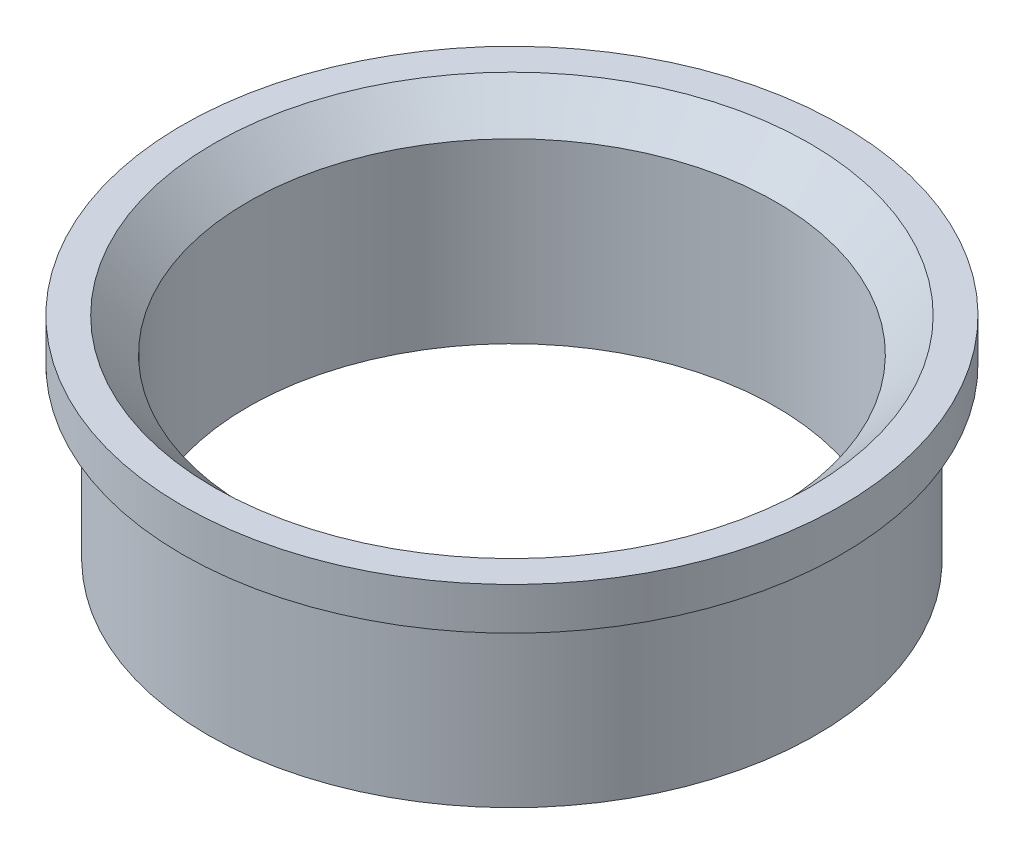
ISO-10303-21;
HEADER;
FILE_DESCRIPTION(('STEP AP214'),'2;1');
FILE_NAME('part.step','',(''),(''),'','','');
FILE_SCHEMA(('AUTOMOTIVE_DESIGN { 1 0 10303 214 1 1 1 1 }'));
ENDSEC;
DATA;
#1=APPLICATION_CONTEXT('core data for automotive mechanical design processes');
#2=APPLICATION_PROTOCOL_DEFINITION('international standard','automotive_design',2000,#1);
#3=PRODUCT_CONTEXT('',#1,'mechanical');
#4=PRODUCT('Part','Part','',(#3));
#5=PRODUCT_RELATED_PRODUCT_CATEGORY('part','',(#4));
#6=PRODUCT_DEFINITION_FORMATION('','',#4);
#7=PRODUCT_DEFINITION_CONTEXT('part definition',#1,'design');
#8=PRODUCT_DEFINITION('design','',#6,#7);
#9=PRODUCT_DEFINITION_SHAPE('','',#8);
#10=(LENGTH_UNIT() NAMED_UNIT(*) SI_UNIT(.MILLI.,.METRE.));
#11=(NAMED_UNIT(*) PLANE_ANGLE_UNIT() SI_UNIT($,.RADIAN.));
#12=(NAMED_UNIT(*) SI_UNIT($,.STERADIAN.) SOLID_ANGLE_UNIT());
#13=UNCERTAINTY_MEASURE_WITH_UNIT(LENGTH_MEASURE(1.E-05),#10,'distance_accuracy_value','');
#14=(GEOMETRIC_REPRESENTATION_CONTEXT(3) GLOBAL_UNCERTAINTY_ASSIGNED_CONTEXT((#13)) GLOBAL_UNIT_ASSIGNED_CONTEXT((#10,
#11,#12)) REPRESENTATION_CONTEXT('',''));
#15=CARTESIAN_POINT('',(0.,0.,0.));
#16=DIRECTION('',(0.,0.,1.));
#17=DIRECTION('',(1.,0.,0.));
#18=AXIS2_PLACEMENT_3D('',#15,#16,#17);
#19=CARTESIAN_POINT('',(72.,0.,0.));
#20=DIRECTION('',(0.,1.,0.));
#21=DIRECTION('',(0.,0.,1.));
#22=AXIS2_PLACEMENT_3D('',#19,#20,#21);
#23=PLANE('',#22);
#24=CARTESIAN_POINT('',(0.,0.,0.));
#25=DIRECTION('',(0.,1.,0.));
#26=DIRECTION('',(0.,0.,1.));
#27=AXIS2_PLACEMENT_3D('',#24,#25,#26);
#28=CIRCLE('',#27,72.);
#29=CARTESIAN_POINT('',(0.,0.,72.));
#30=VERTEX_POINT('',#29);
#31=EDGE_CURVE('E55',#30,#30,#28,.T.);
#32=ORIENTED_EDGE('',*,*,#31,.F.);
#33=EDGE_LOOP('',(#32));
#34=FACE_BOUND('',#33,.T.);
#35=CARTESIAN_POINT('',(0.,0.,0.));
#36=DIRECTION('',(0.,1.,0.));
#37=DIRECTION('',(0.,0.,1.));
#38=AXIS2_PLACEMENT_3D('',#35,#36,#37);
#39=CIRCLE('',#38,62.5);
#40=CARTESIAN_POINT('',(0.,0.,62.5));
#41=VERTEX_POINT('',#40);
#42=EDGE_CURVE('E10',#41,#41,#39,.T.);
#43=ORIENTED_EDGE('',*,*,#42,.T.);
#44=EDGE_LOOP('',(#43));
#45=FACE_BOUND('',#44,.T.);
#46=ADVANCED_FACE('F30',(#34,#45),#23,.F.);
#47=CARTESIAN_POINT('',(0.,72.788119525236,0.));
#48=DIRECTION('',(0.,1.,0.));
#49=DIRECTION('',(0.,0.,1.));
#50=AXIS2_PLACEMENT_3D('',#47,#48,#49);
#51=CYLINDRICAL_SURFACE('',#50,62.5);
#52=ORIENTED_EDGE('',*,*,#42,.F.);
#53=EDGE_LOOP('',(#52));
#54=FACE_BOUND('',#53,.T.);
#55=CARTESIAN_POINT('',(0.,42.,0.));
#56=DIRECTION('',(0.,1.,0.));
#57=DIRECTION('',(0.,0.,1.));
#58=AXIS2_PLACEMENT_3D('',#55,#56,#57);
#59=CIRCLE('',#58,62.5);
#60=CARTESIAN_POINT('',(0.,42.,62.5));
#61=VERTEX_POINT('',#60);
#62=EDGE_CURVE('E36',#61,#61,#59,.T.);
#63=ORIENTED_EDGE('',*,*,#62,.T.);
#64=EDGE_LOOP('',(#63));
#65=FACE_BOUND('',#64,.T.);
#66=ADVANCED_FACE('F62',(#54,#65),#51,.F.);
#67=CARTESIAN_POINT('',(0.,50.,0.));
#68=DIRECTION('',(0.,1.,0.));
#69=DIRECTION('',(0.,0.,1.));
#70=AXIS2_PLACEMENT_3D('',#67,#68,#69);
#71=CONICAL_SURFACE('',#70,70.5,0.785398163397449);
#72=ORIENTED_EDGE('',*,*,#62,.F.);
#73=EDGE_LOOP('',(#72));
#74=FACE_BOUND('',#73,.T.);
#75=CARTESIAN_POINT('',(0.,50.,0.));
#76=DIRECTION('',(0.,1.,0.));
#77=DIRECTION('',(0.,0.,1.));
#78=AXIS2_PLACEMENT_3D('',#75,#76,#77);
#79=CIRCLE('',#78,70.5);
#80=CARTESIAN_POINT('',(0.,50.,70.5));
#81=VERTEX_POINT('',#80);
#82=EDGE_CURVE('E40',#81,#81,#79,.T.);
#83=ORIENTED_EDGE('',*,*,#82,.T.);
#84=EDGE_LOOP('',(#83));
#85=FACE_BOUND('',#84,.T.);
#86=ADVANCED_FACE('F66',(#74,#85),#71,.F.);
#87=CARTESIAN_POINT('',(70.5,50.,0.));
#88=DIRECTION('',(0.,-1.,0.));
#89=DIRECTION('',(0.,0.,-1.));
#90=AXIS2_PLACEMENT_3D('',#87,#88,#89);
#91=PLANE('',#90);
#92=ORIENTED_EDGE('',*,*,#82,.F.);
#93=EDGE_LOOP('',(#92));
#94=FACE_BOUND('',#93,.T.);
#95=CARTESIAN_POINT('',(0.,50.,0.));
#96=DIRECTION('',(0.,1.,0.));
#97=DIRECTION('',(0.,0.,1.));
#98=AXIS2_PLACEMENT_3D('',#95,#96,#97);
#99=CIRCLE('',#98,78.);
#100=CARTESIAN_POINT('',(0.,50.,78.));
#101=VERTEX_POINT('',#100);
#102=EDGE_CURVE('E44',#101,#101,#99,.T.);
#103=ORIENTED_EDGE('',*,*,#102,.T.);
#104=EDGE_LOOP('',(#103));
#105=FACE_BOUND('',#104,.T.);
#106=ADVANCED_FACE('F71',(#94,#105),#91,.F.);
#107=CARTESIAN_POINT('',(0.,72.788119525236,0.));
#108=DIRECTION('',(0.,1.,0.));
#109=DIRECTION('',(0.,0.,1.));
#110=AXIS2_PLACEMENT_3D('',#107,#108,#109);
#111=CYLINDRICAL_SURFACE('',#110,78.);
#112=ORIENTED_EDGE('',*,*,#102,.F.);
#113=EDGE_LOOP('',(#112));
#114=FACE_BOUND('',#113,.T.);
#115=CARTESIAN_POINT('',(0.,40.,0.));
#116=DIRECTION('',(0.,1.,0.));
#117=DIRECTION('',(0.,0.,1.));
#118=AXIS2_PLACEMENT_3D('',#115,#116,#117);
#119=CIRCLE('',#118,78.);
#120=CARTESIAN_POINT('',(0.,40.,78.));
#121=VERTEX_POINT('',#120);
#122=EDGE_CURVE('E49',#121,#121,#119,.T.);
#123=ORIENTED_EDGE('',*,*,#122,.T.);
#124=EDGE_LOOP('',(#123));
#125=FACE_BOUND('',#124,.T.);
#126=ADVANCED_FACE('F77',(#114,#125),#111,.T.);
#127=CARTESIAN_POINT('',(78.,40.,0.));
#128=DIRECTION('',(0.,1.,0.));
#129=DIRECTION('',(0.,0.,1.));
#130=AXIS2_PLACEMENT_3D('',#127,#128,#129);
#131=PLANE('',#130);
#132=ORIENTED_EDGE('',*,*,#122,.F.);
#133=EDGE_LOOP('',(#132));
#134=FACE_BOUND('',#133,.T.);
#135=CARTESIAN_POINT('',(0.,40.,0.));
#136=DIRECTION('',(0.,1.,0.));
#137=DIRECTION('',(0.,0.,1.));
#138=AXIS2_PLACEMENT_3D('',#135,#136,#137);
#139=CIRCLE('',#138,72.);
#140=CARTESIAN_POINT('',(0.,40.,72.));
#141=VERTEX_POINT('',#140);
#142=EDGE_CURVE('E52',#141,#141,#139,.T.);
#143=ORIENTED_EDGE('',*,*,#142,.T.);
#144=EDGE_LOOP('',(#143));
#145=FACE_BOUND('',#144,.T.);
#146=ADVANCED_FACE('F81',(#134,#145),#131,.F.);
#147=CARTESIAN_POINT('',(0.,72.788119525236,0.));
#148=DIRECTION('',(0.,1.,0.));
#149=DIRECTION('',(0.,0.,1.));
#150=AXIS2_PLACEMENT_3D('',#147,#148,#149);
#151=CYLINDRICAL_SURFACE('',#150,72.);
#152=ORIENTED_EDGE('',*,*,#142,.F.);
#153=EDGE_LOOP('',(#152));
#154=FACE_BOUND('',#153,.T.);
#155=ORIENTED_EDGE('',*,*,#31,.T.);
#156=EDGE_LOOP('',(#155));
#157=FACE_BOUND('',#156,.T.);
#158=ADVANCED_FACE('F59',(#154,#157),#151,.T.);
#159=CLOSED_SHELL('',(#46,#66,#86,#106,#126,#146,#158));
#160=MANIFOLD_SOLID_BREP('B2',#159);
#161=ADVANCED_BREP_SHAPE_REPRESENTATION('',(#18,#160),#14);
#162=SHAPE_DEFINITION_REPRESENTATION(#9,#161);
ENDSEC;
END-ISO-10303-21;
